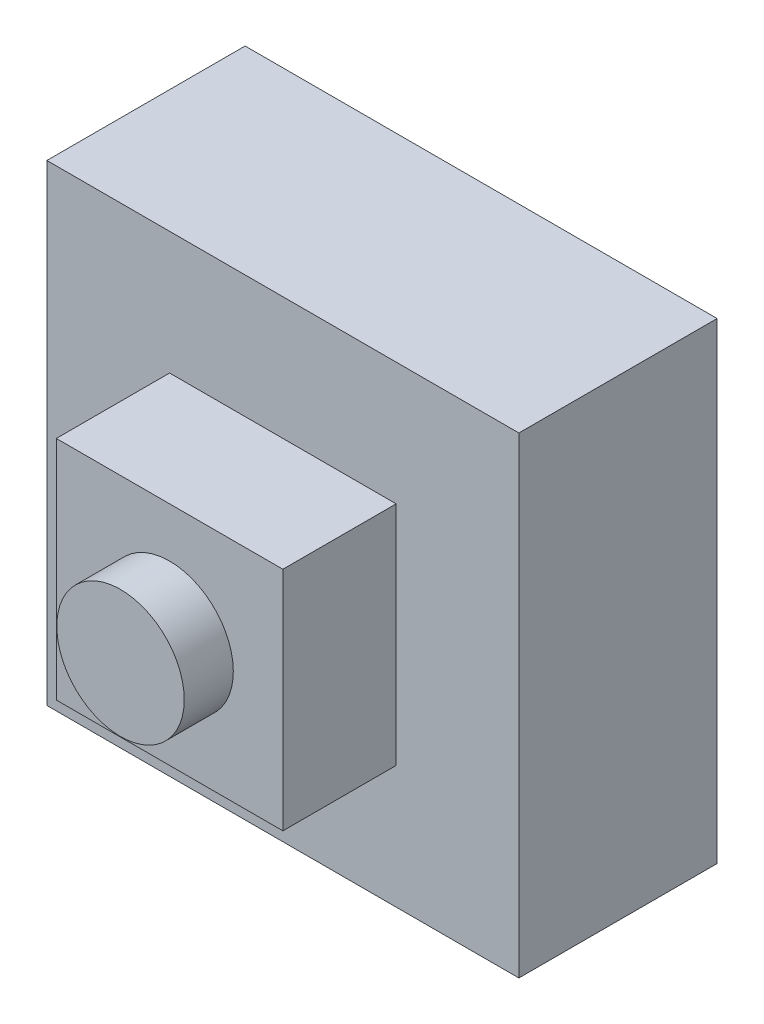
ISO-10303-21;
HEADER;
FILE_DESCRIPTION(('STEP AP214'),'2;1');
FILE_NAME('part.step','',(''),(''),'','','');
FILE_SCHEMA(('AUTOMOTIVE_DESIGN { 1 0 10303 214 1 1 1 1 }'));
ENDSEC;
DATA;
#1=APPLICATION_CONTEXT('core data for automotive mechanical design processes');
#2=APPLICATION_PROTOCOL_DEFINITION('international standard','automotive_design',2000,#1);
#3=PRODUCT_CONTEXT('',#1,'mechanical');
#4=PRODUCT('Part','Part','',(#3));
#5=PRODUCT_RELATED_PRODUCT_CATEGORY('part','',(#4));
#6=PRODUCT_DEFINITION_FORMATION('','',#4);
#7=PRODUCT_DEFINITION_CONTEXT('part definition',#1,'design');
#8=PRODUCT_DEFINITION('design','',#6,#7);
#9=PRODUCT_DEFINITION_SHAPE('','',#8);
#10=(LENGTH_UNIT() NAMED_UNIT(*) SI_UNIT(.MILLI.,.METRE.));
#11=(NAMED_UNIT(*) PLANE_ANGLE_UNIT() SI_UNIT($,.RADIAN.));
#12=(NAMED_UNIT(*) SI_UNIT($,.STERADIAN.) SOLID_ANGLE_UNIT());
#13=UNCERTAINTY_MEASURE_WITH_UNIT(LENGTH_MEASURE(1.E-05),#10,'distance_accuracy_value','');
#14=(GEOMETRIC_REPRESENTATION_CONTEXT(3) GLOBAL_UNCERTAINTY_ASSIGNED_CONTEXT((#13)) GLOBAL_UNIT_ASSIGNED_CONTEXT((#10,
#11,#12)) REPRESENTATION_CONTEXT('',''));
#15=CARTESIAN_POINT('',(0.,0.,0.));
#16=DIRECTION('',(0.,0.,1.));
#17=DIRECTION('',(1.,0.,0.));
#18=AXIS2_PLACEMENT_3D('',#15,#16,#17);
#19=CARTESIAN_POINT('',(3.048,-3.048,5.715));
#20=DIRECTION('',(-1.,0.,0.));
#21=DIRECTION('',(0.,0.,1.));
#22=AXIS2_PLACEMENT_3D('',#19,#20,#21);
#23=PLANE('',#22);
#24=DIRECTION('',(0.,-1.,0.));
#25=VECTOR('',#24,1.);
#26=CARTESIAN_POINT('',(3.048,-3.048,2.667));
#27=LINE('',#26,#25);
#28=CARTESIAN_POINT('',(3.048,3.048,2.667));
#29=VERTEX_POINT('',#28);
#30=CARTESIAN_POINT('',(3.048,-3.048,2.667));
#31=VERTEX_POINT('',#30);
#32=EDGE_CURVE('E53',#29,#31,#27,.T.);
#33=ORIENTED_EDGE('',*,*,#32,.F.);
#34=DIRECTION('',(0.,0.,-1.));
#35=VECTOR('',#34,1.);
#36=CARTESIAN_POINT('',(3.048,3.048,5.715));
#37=LINE('',#36,#35);
#38=CARTESIAN_POINT('',(3.048,3.048,5.715));
#39=VERTEX_POINT('',#38);
#40=EDGE_CURVE('E188',#39,#29,#37,.T.);
#41=ORIENTED_EDGE('',*,*,#40,.F.);
#42=DIRECTION('',(0.,1.,0.));
#43=VECTOR('',#42,1.);
#44=CARTESIAN_POINT('',(3.048,-3.048,5.715));
#45=LINE('',#44,#43);
#46=CARTESIAN_POINT('',(3.048,-3.048,5.715));
#47=VERTEX_POINT('',#46);
#48=EDGE_CURVE('E189',#47,#39,#45,.T.);
#49=ORIENTED_EDGE('',*,*,#48,.F.);
#50=DIRECTION('',(0.,0.,-1.));
#51=VECTOR('',#50,1.);
#52=CARTESIAN_POINT('',(3.048,-3.048,5.715));
#53=LINE('',#52,#51);
#54=EDGE_CURVE('E210',#47,#31,#53,.T.);
#55=ORIENTED_EDGE('',*,*,#54,.T.);
#56=EDGE_LOOP('',(#33,#41,#49,#55));
#57=FACE_BOUND('',#56,.T.);
#58=ADVANCED_FACE('F38',(#57),#23,.F.);
#59=CARTESIAN_POINT('',(-3.048,3.048,5.715));
#60=DIRECTION('',(0.,-1.,0.));
#61=DIRECTION('',(0.,0.,-1.));
#62=AXIS2_PLACEMENT_3D('',#59,#60,#61);
#63=PLANE('',#62);
#64=DIRECTION('',(1.,0.,0.));
#65=VECTOR('',#64,1.);
#66=CARTESIAN_POINT('',(-3.048,3.048,2.667));
#67=LINE('',#66,#65);
#68=CARTESIAN_POINT('',(-3.048,3.048,2.667));
#69=VERTEX_POINT('',#68);
#70=EDGE_CURVE('E60',#69,#29,#67,.T.);
#71=ORIENTED_EDGE('',*,*,#70,.F.);
#72=DIRECTION('',(0.,0.,-1.));
#73=VECTOR('',#72,1.);
#74=CARTESIAN_POINT('',(-3.048,3.048,5.715));
#75=LINE('',#74,#73);
#76=CARTESIAN_POINT('',(-3.048,3.048,5.715));
#77=VERTEX_POINT('',#76);
#78=EDGE_CURVE('E216',#77,#69,#75,.T.);
#79=ORIENTED_EDGE('',*,*,#78,.F.);
#80=DIRECTION('',(-1.,0.,0.));
#81=VECTOR('',#80,1.);
#82=CARTESIAN_POINT('',(-3.048,3.048,5.715));
#83=LINE('',#82,#81);
#84=EDGE_CURVE('E192',#39,#77,#83,.T.);
#85=ORIENTED_EDGE('',*,*,#84,.F.);
#86=ORIENTED_EDGE('',*,*,#40,.T.);
#87=EDGE_LOOP('',(#71,#79,#85,#86));
#88=FACE_BOUND('',#87,.T.);
#89=ADVANCED_FACE('F240',(#88),#63,.F.);
#90=CARTESIAN_POINT('',(-3.048,-3.048,5.715));
#91=DIRECTION('',(1.,0.,0.));
#92=DIRECTION('',(0.,0.,-1.));
#93=AXIS2_PLACEMENT_3D('',#90,#91,#92);
#94=PLANE('',#93);
#95=DIRECTION('',(0.,1.,0.));
#96=VECTOR('',#95,1.);
#97=CARTESIAN_POINT('',(-3.048,-3.048,2.667));
#98=LINE('',#97,#96);
#99=CARTESIAN_POINT('',(-3.048,-3.048,2.667));
#100=VERTEX_POINT('',#99);
#101=EDGE_CURVE('E170',#100,#69,#98,.T.);
#102=ORIENTED_EDGE('',*,*,#101,.F.);
#103=DIRECTION('',(0.,0.,-1.));
#104=VECTOR('',#103,1.);
#105=CARTESIAN_POINT('',(-3.048,-3.048,5.715));
#106=LINE('',#105,#104);
#107=CARTESIAN_POINT('',(-3.048,-3.048,5.715));
#108=VERTEX_POINT('',#107);
#109=EDGE_CURVE('E213',#108,#100,#106,.T.);
#110=ORIENTED_EDGE('',*,*,#109,.F.);
#111=DIRECTION('',(0.,-1.,0.));
#112=VECTOR('',#111,1.);
#113=CARTESIAN_POINT('',(-3.048,-3.048,5.715));
#114=LINE('',#113,#112);
#115=EDGE_CURVE('E195',#77,#108,#114,.T.);
#116=ORIENTED_EDGE('',*,*,#115,.F.);
#117=ORIENTED_EDGE('',*,*,#78,.T.);
#118=EDGE_LOOP('',(#102,#110,#116,#117));
#119=FACE_BOUND('',#118,.T.);
#120=ADVANCED_FACE('F246',(#119),#94,.F.);
#121=CARTESIAN_POINT('',(-3.048,-3.048,5.715));
#122=DIRECTION('',(0.,1.,0.));
#123=DIRECTION('',(0.,0.,1.));
#124=AXIS2_PLACEMENT_3D('',#121,#122,#123);
#125=PLANE('',#124);
#126=DIRECTION('',(-1.,0.,0.));
#127=VECTOR('',#126,1.);
#128=CARTESIAN_POINT('',(-3.048,-3.048,2.667));
#129=LINE('',#128,#127);
#130=EDGE_CURVE('E11',#31,#100,#129,.T.);
#131=ORIENTED_EDGE('',*,*,#130,.F.);
#132=ORIENTED_EDGE('',*,*,#54,.F.);
#133=DIRECTION('',(1.,0.,0.));
#134=VECTOR('',#133,1.);
#135=CARTESIAN_POINT('',(-3.048,-3.048,5.715));
#136=LINE('',#135,#134);
#137=EDGE_CURVE('E197',#108,#47,#136,.T.);
#138=ORIENTED_EDGE('',*,*,#137,.F.);
#139=ORIENTED_EDGE('',*,*,#109,.T.);
#140=EDGE_LOOP('',(#131,#132,#138,#139));
#141=FACE_BOUND('',#140,.T.);
#142=ADVANCED_FACE('F268',(#141),#125,.F.);
#143=CARTESIAN_POINT('',(0.,0.,5.715));
#144=DIRECTION('',(0.,0.,-1.));
#145=DIRECTION('',(-1.,0.,0.));
#146=AXIS2_PLACEMENT_3D('',#143,#144,#145);
#147=PLANE('',#146);
#148=CARTESIAN_POINT('',(0.,0.,5.715));
#149=DIRECTION('',(0.,0.,1.));
#150=DIRECTION('',(1.,0.,0.));
#151=AXIS2_PLACEMENT_3D('',#148,#149,#150);
#152=CIRCLE('',#151,1.7145);
#153=CARTESIAN_POINT('',(1.7145,0.,5.715));
#154=VERTEX_POINT('',#153);
#155=EDGE_CURVE('E185',#154,#154,#152,.T.);
#156=ORIENTED_EDGE('',*,*,#155,.F.);
#157=EDGE_LOOP('',(#156));
#158=FACE_BOUND('',#157,.T.);
#159=ORIENTED_EDGE('',*,*,#48,.T.);
#160=ORIENTED_EDGE('',*,*,#84,.T.);
#161=ORIENTED_EDGE('',*,*,#115,.T.);
#162=ORIENTED_EDGE('',*,*,#137,.T.);
#163=EDGE_LOOP('',(#159,#160,#161,#162));
#164=FACE_BOUND('',#163,.T.);
#165=ADVANCED_FACE('F275',(#158,#164),#147,.F.);
#166=CARTESIAN_POINT('',(0.,0.,7.0358));
#167=DIRECTION('',(0.,0.,-1.));
#168=DIRECTION('',(-1.,0.,0.));
#169=AXIS2_PLACEMENT_3D('',#166,#167,#168);
#170=CYLINDRICAL_SURFACE('',#169,1.7145);
#171=CARTESIAN_POINT('',(0.,0.,7.0358));
#172=DIRECTION('',(0.,0.,1.));
#173=DIRECTION('',(1.,0.,0.));
#174=AXIS2_PLACEMENT_3D('',#171,#172,#173);
#175=CIRCLE('',#174,1.7145);
#176=CARTESIAN_POINT('',(1.7145,0.,7.0358));
#177=VERTEX_POINT('',#176);
#178=EDGE_CURVE('E179',#177,#177,#175,.T.);
#179=ORIENTED_EDGE('',*,*,#178,.F.);
#180=EDGE_LOOP('',(#179));
#181=FACE_BOUND('',#180,.T.);
#182=ORIENTED_EDGE('',*,*,#155,.T.);
#183=EDGE_LOOP('',(#182));
#184=FACE_BOUND('',#183,.T.);
#185=ADVANCED_FACE('F362',(#181,#184),#170,.T.);
#186=CARTESIAN_POINT('',(0.,0.,7.0358));
#187=DIRECTION('',(0.,0.,1.));
#188=DIRECTION('',(1.,0.,0.));
#189=AXIS2_PLACEMENT_3D('',#186,#187,#188);
#190=PLANE('',#189);
#191=ORIENTED_EDGE('',*,*,#178,.T.);
#192=EDGE_LOOP('',(#191));
#193=FACE_BOUND('',#192,.T.);
#194=ADVANCED_FACE('F284',(#193),#190,.T.);
#195=CARTESIAN_POINT('',(0.,0.,2.667));
#196=DIRECTION('',(0.,0.,-1.));
#197=DIRECTION('',(-1.,0.,0.));
#198=AXIS2_PLACEMENT_3D('',#195,#196,#197);
#199=PLANE('',#198);
#200=DIRECTION('',(0.,1.,0.));
#201=VECTOR('',#200,1.);
#202=CARTESIAN_POINT('',(6.35,-6.35,2.667));
#203=LINE('',#202,#201);
#204=CARTESIAN_POINT('',(6.35,-6.35,2.667));
#205=VERTEX_POINT('',#204);
#206=CARTESIAN_POINT('',(6.35,6.35,2.667));
#207=VERTEX_POINT('',#206);
#208=EDGE_CURVE('E141',#205,#207,#203,.T.);
#209=ORIENTED_EDGE('',*,*,#208,.T.);
#210=DIRECTION('',(-1.,0.,0.));
#211=VECTOR('',#210,1.);
#212=CARTESIAN_POINT('',(-6.35,6.35,2.667));
#213=LINE('',#212,#211);
#214=CARTESIAN_POINT('',(-6.35,6.35,2.667));
#215=VERTEX_POINT('',#214);
#216=EDGE_CURVE('E130',#207,#215,#213,.T.);
#217=ORIENTED_EDGE('',*,*,#216,.T.);
#218=DIRECTION('',(0.,-1.,0.));
#219=VECTOR('',#218,1.);
#220=CARTESIAN_POINT('',(-6.35,-6.35,2.667));
#221=LINE('',#220,#219);
#222=CARTESIAN_POINT('',(-6.35,-6.35,2.667));
#223=VERTEX_POINT('',#222);
#224=EDGE_CURVE('E140',#215,#223,#221,.T.);
#225=ORIENTED_EDGE('',*,*,#224,.T.);
#226=DIRECTION('',(1.,0.,0.));
#227=VECTOR('',#226,1.);
#228=CARTESIAN_POINT('',(-6.35,-6.35,2.667));
#229=LINE('',#228,#227);
#230=EDGE_CURVE('E147',#223,#205,#229,.T.);
#231=ORIENTED_EDGE('',*,*,#230,.T.);
#232=EDGE_LOOP('',(#209,#217,#225,#231));
#233=FACE_BOUND('',#232,.T.);
#234=ORIENTED_EDGE('',*,*,#70,.T.);
#235=ORIENTED_EDGE('',*,*,#32,.T.);
#236=ORIENTED_EDGE('',*,*,#130,.T.);
#237=ORIENTED_EDGE('',*,*,#101,.T.);
#238=EDGE_LOOP('',(#234,#235,#236,#237));
#239=FACE_BOUND('',#238,.T.);
#240=ADVANCED_FACE('F144',(#233,#239),#199,.F.);
#241=CARTESIAN_POINT('',(0.,0.,-2.667));
#242=DIRECTION('',(0.,0.,-1.));
#243=DIRECTION('',(-1.,0.,0.));
#244=AXIS2_PLACEMENT_3D('',#241,#242,#243);
#245=PLANE('',#244);
#246=DIRECTION('',(0.,1.,0.));
#247=VECTOR('',#246,1.);
#248=CARTESIAN_POINT('',(6.35,-6.35,-2.667));
#249=LINE('',#248,#247);
#250=CARTESIAN_POINT('',(6.35,-6.35,-2.667));
#251=VERTEX_POINT('',#250);
#252=CARTESIAN_POINT('',(6.35,6.35,-2.667));
#253=VERTEX_POINT('',#252);
#254=EDGE_CURVE('E155',#251,#253,#249,.T.);
#255=ORIENTED_EDGE('',*,*,#254,.F.);
#256=DIRECTION('',(1.,0.,0.));
#257=VECTOR('',#256,1.);
#258=CARTESIAN_POINT('',(-6.35,-6.35,-2.667));
#259=LINE('',#258,#257);
#260=CARTESIAN_POINT('',(-6.35,-6.35,-2.667));
#261=VERTEX_POINT('',#260);
#262=EDGE_CURVE('E151',#261,#251,#259,.T.);
#263=ORIENTED_EDGE('',*,*,#262,.F.);
#264=DIRECTION('',(0.,-1.,0.));
#265=VECTOR('',#264,1.);
#266=CARTESIAN_POINT('',(-6.35,-6.35,-2.667));
#267=LINE('',#266,#265);
#268=CARTESIAN_POINT('',(-6.35,6.35,-2.667));
#269=VERTEX_POINT('',#268);
#270=EDGE_CURVE('E432',#269,#261,#267,.T.);
#271=ORIENTED_EDGE('',*,*,#270,.F.);
#272=DIRECTION('',(-1.,0.,0.));
#273=VECTOR('',#272,1.);
#274=CARTESIAN_POINT('',(-6.35,6.35,-2.667));
#275=LINE('',#274,#273);
#276=EDGE_CURVE('E435',#253,#269,#275,.T.);
#277=ORIENTED_EDGE('',*,*,#276,.F.);
#278=EDGE_LOOP('',(#255,#263,#271,#277));
#279=FACE_BOUND('',#278,.T.);
#280=DIRECTION('',(0.,-1.,0.));
#281=VECTOR('',#280,1.);
#282=CARTESIAN_POINT('',(3.048,-3.048,-2.667));
#283=LINE('',#282,#281);
#284=CARTESIAN_POINT('',(3.048,3.048,-2.667));
#285=VERTEX_POINT('',#284);
#286=CARTESIAN_POINT('',(3.048,-3.048,-2.667));
#287=VERTEX_POINT('',#286);
#288=EDGE_CURVE('E167',#285,#287,#283,.T.);
#289=ORIENTED_EDGE('',*,*,#288,.F.);
#290=DIRECTION('',(1.,0.,0.));
#291=VECTOR('',#290,1.);
#292=CARTESIAN_POINT('',(-3.048,3.048,-2.667));
#293=LINE('',#292,#291);
#294=CARTESIAN_POINT('',(-3.048,3.048,-2.667));
#295=VERTEX_POINT('',#294);
#296=EDGE_CURVE('E159',#295,#285,#293,.T.);
#297=ORIENTED_EDGE('',*,*,#296,.F.);
#298=DIRECTION('',(0.,1.,0.));
#299=VECTOR('',#298,1.);
#300=CARTESIAN_POINT('',(-3.048,-3.048,-2.667));
#301=LINE('',#300,#299);
#302=CARTESIAN_POINT('',(-3.048,-3.048,-2.667));
#303=VERTEX_POINT('',#302);
#304=EDGE_CURVE('E156',#303,#295,#301,.T.);
#305=ORIENTED_EDGE('',*,*,#304,.F.);
#306=DIRECTION('',(-1.,0.,0.));
#307=VECTOR('',#306,1.);
#308=CARTESIAN_POINT('',(-3.048,-3.048,-2.667));
#309=LINE('',#308,#307);
#310=EDGE_CURVE('E46',#287,#303,#309,.T.);
#311=ORIENTED_EDGE('',*,*,#310,.F.);
#312=EDGE_LOOP('',(#289,#297,#305,#311));
#313=FACE_BOUND('',#312,.T.);
#314=ADVANCED_FACE('F236',(#279,#313),#245,.T.);
#315=CARTESIAN_POINT('',(6.35,-6.35,2.667));
#316=DIRECTION('',(-1.,0.,0.));
#317=DIRECTION('',(0.,0.,1.));
#318=AXIS2_PLACEMENT_3D('',#315,#316,#317);
#319=PLANE('',#318);
#320=ORIENTED_EDGE('',*,*,#254,.T.);
#321=DIRECTION('',(0.,0.,-1.));
#322=VECTOR('',#321,1.);
#323=CARTESIAN_POINT('',(6.35,6.35,2.667));
#324=LINE('',#323,#322);
#325=EDGE_CURVE('E134',#207,#253,#324,.T.);
#326=ORIENTED_EDGE('',*,*,#325,.F.);
#327=ORIENTED_EDGE('',*,*,#208,.F.);
#328=DIRECTION('',(0.,0.,-1.));
#329=VECTOR('',#328,1.);
#330=CARTESIAN_POINT('',(6.35,-6.35,2.667));
#331=LINE('',#330,#329);
#332=EDGE_CURVE('E429',#205,#251,#331,.T.);
#333=ORIENTED_EDGE('',*,*,#332,.T.);
#334=EDGE_LOOP('',(#320,#326,#327,#333));
#335=FACE_BOUND('',#334,.T.);
#336=ADVANCED_FACE('F153',(#335),#319,.F.);
#337=CARTESIAN_POINT('',(-6.35,6.35,2.667));
#338=DIRECTION('',(0.,-1.,0.));
#339=DIRECTION('',(0.,0.,-1.));
#340=AXIS2_PLACEMENT_3D('',#337,#338,#339);
#341=PLANE('',#340);
#342=ORIENTED_EDGE('',*,*,#276,.T.);
#343=DIRECTION('',(0.,0.,-1.));
#344=VECTOR('',#343,1.);
#345=CARTESIAN_POINT('',(-6.35,6.35,2.667));
#346=LINE('',#345,#344);
#347=EDGE_CURVE('E137',#215,#269,#346,.T.);
#348=ORIENTED_EDGE('',*,*,#347,.F.);
#349=ORIENTED_EDGE('',*,*,#216,.F.);
#350=ORIENTED_EDGE('',*,*,#325,.T.);
#351=EDGE_LOOP('',(#342,#348,#349,#350));
#352=FACE_BOUND('',#351,.T.);
#353=ADVANCED_FACE('F132',(#352),#341,.F.);
#354=CARTESIAN_POINT('',(-6.35,-6.35,2.667));
#355=DIRECTION('',(1.,0.,0.));
#356=DIRECTION('',(0.,0.,-1.));
#357=AXIS2_PLACEMENT_3D('',#354,#355,#356);
#358=PLANE('',#357);
#359=ORIENTED_EDGE('',*,*,#270,.T.);
#360=DIRECTION('',(0.,0.,-1.));
#361=VECTOR('',#360,1.);
#362=CARTESIAN_POINT('',(-6.35,-6.35,2.667));
#363=LINE('',#362,#361);
#364=EDGE_CURVE('E161',#223,#261,#363,.T.);
#365=ORIENTED_EDGE('',*,*,#364,.F.);
#366=ORIENTED_EDGE('',*,*,#224,.F.);
#367=ORIENTED_EDGE('',*,*,#347,.T.);
#368=EDGE_LOOP('',(#359,#365,#366,#367));
#369=FACE_BOUND('',#368,.T.);
#370=ADVANCED_FACE('F310',(#369),#358,.F.);
#371=CARTESIAN_POINT('',(-6.35,-6.35,2.667));
#372=DIRECTION('',(0.,1.,0.));
#373=DIRECTION('',(0.,0.,1.));
#374=AXIS2_PLACEMENT_3D('',#371,#372,#373);
#375=PLANE('',#374);
#376=ORIENTED_EDGE('',*,*,#262,.T.);
#377=ORIENTED_EDGE('',*,*,#332,.F.);
#378=ORIENTED_EDGE('',*,*,#230,.F.);
#379=ORIENTED_EDGE('',*,*,#364,.T.);
#380=EDGE_LOOP('',(#376,#377,#378,#379));
#381=FACE_BOUND('',#380,.T.);
#382=ADVANCED_FACE('F319',(#381),#375,.F.);
#383=CARTESIAN_POINT('',(0.,0.,-7.0358));
#384=DIRECTION('',(0.,0.,-1.));
#385=DIRECTION('',(1.,0.,0.));
#386=AXIS2_PLACEMENT_3D('',#383,#384,#385);
#387=PLANE('',#386);
#388=CARTESIAN_POINT('',(0.,0.,-7.0358));
#389=DIRECTION('',(0.,0.,1.));
#390=DIRECTION('',(1.,0.,0.));
#391=AXIS2_PLACEMENT_3D('',#388,#389,#390);
#392=CIRCLE('',#391,1.7145);
#393=CARTESIAN_POINT('',(1.7145,0.,-7.0358));
#394=VERTEX_POINT('',#393);
#395=EDGE_CURVE('E176',#394,#394,#392,.T.);
#396=ORIENTED_EDGE('',*,*,#395,.F.);
#397=EDGE_LOOP('',(#396));
#398=FACE_BOUND('',#397,.T.);
#399=ADVANCED_FACE('F256',(#398),#387,.T.);
#400=CARTESIAN_POINT('',(0.,0.,-7.0358));
#401=DIRECTION('',(0.,0.,1.));
#402=DIRECTION('',(1.,0.,0.));
#403=AXIS2_PLACEMENT_3D('',#400,#401,#402);
#404=CYLINDRICAL_SURFACE('',#403,1.7145);
#405=ORIENTED_EDGE('',*,*,#395,.T.);
#406=EDGE_LOOP('',(#405));
#407=FACE_BOUND('',#406,.T.);
#408=CARTESIAN_POINT('',(0.,0.,-5.715));
#409=DIRECTION('',(0.,0.,1.));
#410=DIRECTION('',(1.,0.,0.));
#411=AXIS2_PLACEMENT_3D('',#408,#409,#410);
#412=CIRCLE('',#411,1.7145);
#413=CARTESIAN_POINT('',(1.7145,0.,-5.715));
#414=VERTEX_POINT('',#413);
#415=EDGE_CURVE('E175',#414,#414,#412,.T.);
#416=ORIENTED_EDGE('',*,*,#415,.F.);
#417=EDGE_LOOP('',(#416));
#418=FACE_BOUND('',#417,.T.);
#419=ADVANCED_FACE('F372',(#407,#418),#404,.T.);
#420=CARTESIAN_POINT('',(0.,0.,-5.715));
#421=DIRECTION('',(0.,0.,-1.));
#422=DIRECTION('',(-1.,0.,0.));
#423=AXIS2_PLACEMENT_3D('',#420,#421,#422);
#424=PLANE('',#423);
#425=ORIENTED_EDGE('',*,*,#415,.T.);
#426=EDGE_LOOP('',(#425));
#427=FACE_BOUND('',#426,.T.);
#428=DIRECTION('',(0.,1.,0.));
#429=VECTOR('',#428,1.);
#430=CARTESIAN_POINT('',(3.048,-3.048,-5.715));
#431=LINE('',#430,#429);
#432=CARTESIAN_POINT('',(3.048,-3.048,-5.715));
#433=VERTEX_POINT('',#432);
#434=CARTESIAN_POINT('',(3.048,3.048,-5.715));
#435=VERTEX_POINT('',#434);
#436=EDGE_CURVE('E184',#433,#435,#431,.T.);
#437=ORIENTED_EDGE('',*,*,#436,.F.);
#438=DIRECTION('',(1.,0.,0.));
#439=VECTOR('',#438,1.);
#440=CARTESIAN_POINT('',(-3.048,-3.048,-5.715));
#441=LINE('',#440,#439);
#442=CARTESIAN_POINT('',(-3.048,-3.048,-5.715));
#443=VERTEX_POINT('',#442);
#444=EDGE_CURVE('E193',#443,#433,#441,.T.);
#445=ORIENTED_EDGE('',*,*,#444,.F.);
#446=DIRECTION('',(0.,-1.,0.));
#447=VECTOR('',#446,1.);
#448=CARTESIAN_POINT('',(-3.048,-3.048,-5.715));
#449=LINE('',#448,#447);
#450=CARTESIAN_POINT('',(-3.048,3.048,-5.715));
#451=VERTEX_POINT('',#450);
#452=EDGE_CURVE('E205',#451,#443,#449,.T.);
#453=ORIENTED_EDGE('',*,*,#452,.F.);
#454=DIRECTION('',(-1.,0.,0.));
#455=VECTOR('',#454,1.);
#456=CARTESIAN_POINT('',(-3.048,3.048,-5.715));
#457=LINE('',#456,#455);
#458=EDGE_CURVE('E202',#435,#451,#457,.T.);
#459=ORIENTED_EDGE('',*,*,#458,.F.);
#460=EDGE_LOOP('',(#437,#445,#453,#459));
#461=FACE_BOUND('',#460,.T.);
#462=ADVANCED_FACE('F233',(#427,#461),#424,.T.);
#463=EDGE_CURVE('E199',#287,#433,#53,.T.);
#464=ORIENTED_EDGE('',*,*,#463,.F.);
#465=ORIENTED_EDGE('',*,*,#310,.T.);
#466=EDGE_CURVE('E212',#303,#443,#106,.T.);
#467=ORIENTED_EDGE('',*,*,#466,.T.);
#468=ORIENTED_EDGE('',*,*,#444,.T.);
#469=EDGE_LOOP('',(#464,#465,#467,#468));
#470=FACE_BOUND('',#469,.T.);
#471=ADVANCED_FACE('F223',(#470),#125,.F.);
#472=ORIENTED_EDGE('',*,*,#466,.F.);
#473=ORIENTED_EDGE('',*,*,#304,.T.);
#474=EDGE_CURVE('E215',#295,#451,#75,.T.);
#475=ORIENTED_EDGE('',*,*,#474,.T.);
#476=ORIENTED_EDGE('',*,*,#452,.T.);
#477=EDGE_LOOP('',(#472,#473,#475,#476));
#478=FACE_BOUND('',#477,.T.);
#479=ADVANCED_FACE('F226',(#478),#94,.F.);
#480=ORIENTED_EDGE('',*,*,#474,.F.);
#481=ORIENTED_EDGE('',*,*,#296,.T.);
#482=EDGE_CURVE('E218',#285,#435,#37,.T.);
#483=ORIENTED_EDGE('',*,*,#482,.T.);
#484=ORIENTED_EDGE('',*,*,#458,.T.);
#485=EDGE_LOOP('',(#480,#481,#483,#484));
#486=FACE_BOUND('',#485,.T.);
#487=ADVANCED_FACE('F238',(#486),#63,.F.);
#488=ORIENTED_EDGE('',*,*,#482,.F.);
#489=ORIENTED_EDGE('',*,*,#288,.T.);
#490=ORIENTED_EDGE('',*,*,#463,.T.);
#491=ORIENTED_EDGE('',*,*,#436,.T.);
#492=EDGE_LOOP('',(#488,#489,#490,#491));
#493=FACE_BOUND('',#492,.T.);
#494=ADVANCED_FACE('F40',(#493),#23,.F.);
#495=CLOSED_SHELL('',(#58,#89,#120,#142,#165,#185,#194,#240,#314,#336,#353,#370,#382,#399,#419,
#462,#471,#479,#487,#494));
#496=MANIFOLD_SOLID_BREP('B2',#495);
#497=ADVANCED_BREP_SHAPE_REPRESENTATION('',(#18,#496),#14);
#498=SHAPE_DEFINITION_REPRESENTATION(#9,#497);
ENDSEC;
END-ISO-10303-21;
